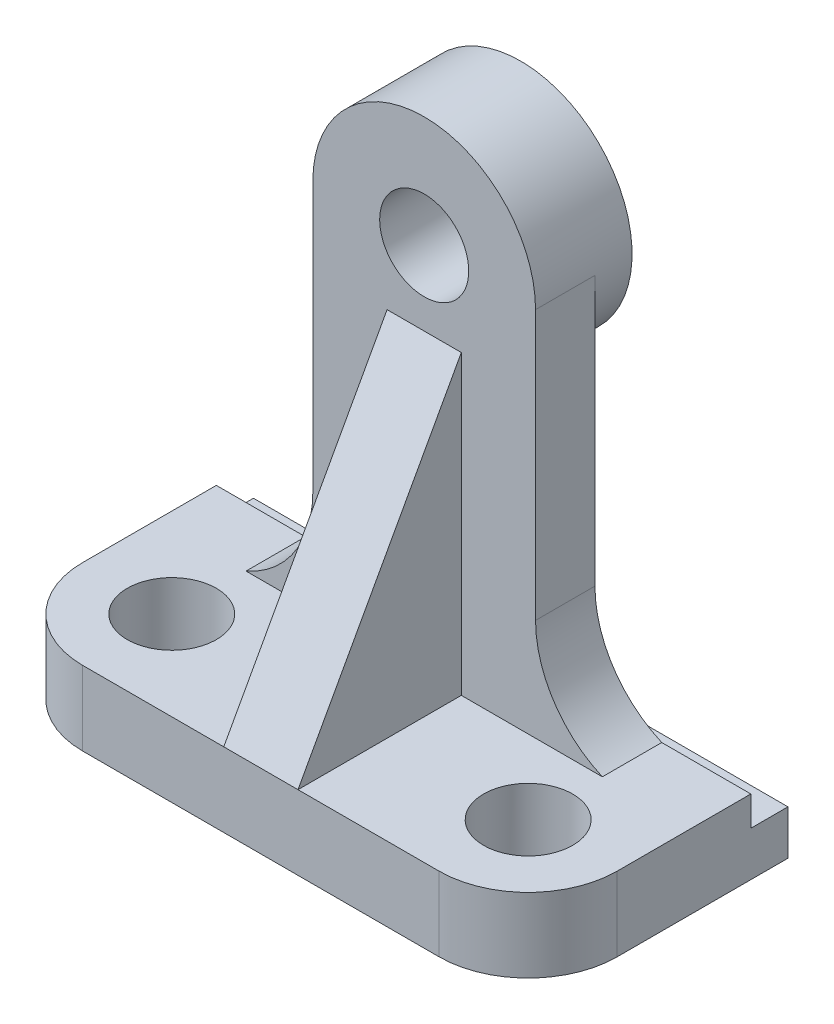
ISO-10303-21;
HEADER;
FILE_DESCRIPTION(('STEP AP214'),'2;1');
FILE_NAME('part.step','',(''),(''),'','','');
FILE_SCHEMA(('AUTOMOTIVE_DESIGN { 1 0 10303 214 1 1 1 1 }'));
ENDSEC;
DATA;
#1=APPLICATION_CONTEXT('core data for automotive mechanical design processes');
#2=APPLICATION_PROTOCOL_DEFINITION('international standard','automotive_design',2000,#1);
#3=PRODUCT_CONTEXT('',#1,'mechanical');
#4=PRODUCT('Part','Part','',(#3));
#5=PRODUCT_RELATED_PRODUCT_CATEGORY('part','',(#4));
#6=PRODUCT_DEFINITION_FORMATION('','',#4);
#7=PRODUCT_DEFINITION_CONTEXT('part definition',#1,'design');
#8=PRODUCT_DEFINITION('design','',#6,#7);
#9=PRODUCT_DEFINITION_SHAPE('','',#8);
#10=(LENGTH_UNIT() NAMED_UNIT(*) SI_UNIT(.MILLI.,.METRE.));
#11=(NAMED_UNIT(*) PLANE_ANGLE_UNIT() SI_UNIT($,.RADIAN.));
#12=(NAMED_UNIT(*) SI_UNIT($,.STERADIAN.) SOLID_ANGLE_UNIT());
#13=UNCERTAINTY_MEASURE_WITH_UNIT(LENGTH_MEASURE(1.E-05),#10,'distance_accuracy_value','');
#14=(GEOMETRIC_REPRESENTATION_CONTEXT(3) GLOBAL_UNCERTAINTY_ASSIGNED_CONTEXT((#13)) GLOBAL_UNIT_ASSIGNED_CONTEXT((#10,
#11,#12)) REPRESENTATION_CONTEXT('',''));
#15=CARTESIAN_POINT('',(0.,0.,0.));
#16=DIRECTION('',(0.,0.,1.));
#17=DIRECTION('',(1.,0.,0.));
#18=AXIS2_PLACEMENT_3D('',#15,#16,#17);
#19=CARTESIAN_POINT('',(24.,10.,5.50000000000001));
#20=DIRECTION('',(0.,-1.,0.));
#21=DIRECTION('',(0.,0.,-1.));
#22=AXIS2_PLACEMENT_3D('',#19,#20,#21);
#23=PLANE('',#22);
#24=CARTESIAN_POINT('',(-24.,10.,5.49999999999999));
#25=DIRECTION('',(0.,1.,0.));
#26=DIRECTION('',(0.,0.,-1.));
#27=AXIS2_PLACEMENT_3D('',#24,#25,#26);
#28=CIRCLE('',#27,5.99999999999999);
#29=CARTESIAN_POINT('',(-24.,10.,-0.500000000000001));
#30=VERTEX_POINT('',#29);
#31=EDGE_CURVE('E256',#30,#30,#28,.T.);
#32=ORIENTED_EDGE('',*,*,#31,.F.);
#33=EDGE_LOOP('',(#32));
#34=FACE_BOUND('',#33,.T.);
#35=DIRECTION('',(0.,0.,1.));
#36=VECTOR('',#35,1.);
#37=CARTESIAN_POINT('',(-5.,10.,5.50000000000001));
#38=LINE('',#37,#36);
#39=CARTESIAN_POINT('',(-5.,10.,-4.50000000000002));
#40=VERTEX_POINT('',#39);
#41=CARTESIAN_POINT('',(-5.,10.,17.5));
#42=VERTEX_POINT('',#41);
#43=EDGE_CURVE('E173',#40,#42,#38,.T.);
#44=ORIENTED_EDGE('',*,*,#43,.F.);
#45=DIRECTION('',(-1.,0.,0.));
#46=VECTOR('',#45,1.);
#47=CARTESIAN_POINT('',(-24.,10.,-4.50000000000001));
#48=LINE('',#47,#46);
#49=CARTESIAN_POINT('',(-24.,10.,-4.50000000000001));
#50=VERTEX_POINT('',#49);
#51=EDGE_CURVE('E157',#40,#50,#48,.T.);
#52=ORIENTED_EDGE('',*,*,#51,.T.);
#53=DIRECTION('',(0.,0.,-1.));
#54=VECTOR('',#53,1.);
#55=CARTESIAN_POINT('',(-24.,10.,-4.50000000000001));
#56=LINE('',#55,#54);
#57=CARTESIAN_POINT('',(-24.,10.,-12.5));
#58=VERTEX_POINT('',#57);
#59=EDGE_CURVE('E229',#50,#58,#56,.T.);
#60=ORIENTED_EDGE('',*,*,#59,.T.);
#61=DIRECTION('',(-1.,0.,0.));
#62=VECTOR('',#61,1.);
#63=CARTESIAN_POINT('',(24.,10.,-12.5));
#64=LINE('',#63,#62);
#65=CARTESIAN_POINT('',(-36.,10.,-12.5));
#66=VERTEX_POINT('',#65);
#67=EDGE_CURVE('E44',#58,#66,#64,.T.);
#68=ORIENTED_EDGE('',*,*,#67,.T.);
#69=DIRECTION('',(0.,0.,1.));
#70=VECTOR('',#69,1.);
#71=CARTESIAN_POINT('',(-36.,10.,5.50000000000001));
#72=LINE('',#71,#70);
#73=CARTESIAN_POINT('',(-36.,10.,5.50000000000001));
#74=VERTEX_POINT('',#73);
#75=EDGE_CURVE('E301',#66,#74,#72,.T.);
#76=ORIENTED_EDGE('',*,*,#75,.T.);
#77=CARTESIAN_POINT('',(-24.,10.,5.50000000000001));
#78=DIRECTION('',(0.,1.,0.));
#79=DIRECTION('',(0.,0.,-1.));
#80=AXIS2_PLACEMENT_3D('',#77,#78,#79);
#81=CIRCLE('',#80,12.);
#82=CARTESIAN_POINT('',(-24.,10.,17.5));
#83=VERTEX_POINT('',#82);
#84=EDGE_CURVE('E303',#74,#83,#81,.T.);
#85=ORIENTED_EDGE('',*,*,#84,.T.);
#86=DIRECTION('',(1.,0.,0.));
#87=VECTOR('',#86,1.);
#88=CARTESIAN_POINT('',(24.,10.,17.5));
#89=LINE('',#88,#87);
#90=EDGE_CURVE('E174',#83,#42,#89,.T.);
#91=ORIENTED_EDGE('',*,*,#90,.T.);
#92=EDGE_LOOP('',(#44,#52,#60,#68,#76,#85,#91));
#93=FACE_BOUND('',#92,.T.);
#94=ADVANCED_FACE('F35',(#34,#93),#23,.F.);
#95=CARTESIAN_POINT('',(38.,6.,-12.5));
#96=DIRECTION('',(0.,0.,1.));
#97=DIRECTION('',(1.,0.,0.));
#98=AXIS2_PLACEMENT_3D('',#95,#96,#97);
#99=PLANE('',#98);
#100=DIRECTION('',(-1.,0.,0.));
#101=VECTOR('',#100,1.);
#102=CARTESIAN_POINT('',(38.,6.,-12.5));
#103=LINE('',#102,#101);
#104=CARTESIAN_POINT('',(36.,6.,-12.5));
#105=VERTEX_POINT('',#104);
#106=CARTESIAN_POINT('',(-36.,6.,-12.5));
#107=VERTEX_POINT('',#106);
#108=EDGE_CURVE('E292',#105,#107,#103,.T.);
#109=ORIENTED_EDGE('',*,*,#108,.T.);
#110=DIRECTION('',(0.,1.,0.));
#111=VECTOR('',#110,1.);
#112=CARTESIAN_POINT('',(-36.,6.,-12.5));
#113=LINE('',#112,#111);
#114=EDGE_CURVE('E288',#107,#66,#113,.T.);
#115=ORIENTED_EDGE('',*,*,#114,.T.);
#116=ORIENTED_EDGE('',*,*,#67,.F.);
#117=CARTESIAN_POINT('',(-30.,23.7477270848675,-12.5));
#118=DIRECTION('',(0.,0.,1.));
#119=DIRECTION('',(-1.,0.,0.));
#120=AXIS2_PLACEMENT_3D('',#117,#118,#119);
#121=CIRCLE('',#120,15.);
#122=CARTESIAN_POINT('',(-15.,23.7477270848675,-12.5));
#123=VERTEX_POINT('',#122);
#124=EDGE_CURVE('E222',#58,#123,#121,.T.);
#125=ORIENTED_EDGE('',*,*,#124,.T.);
#126=DIRECTION('',(0.,1.,0.));
#127=VECTOR('',#126,1.);
#128=CARTESIAN_POINT('',(-15.,60.,-12.5));
#129=LINE('',#128,#127);
#130=CARTESIAN_POINT('',(-15.,60.,-12.5));
#131=VERTEX_POINT('',#130);
#132=EDGE_CURVE('E207',#123,#131,#129,.T.);
#133=ORIENTED_EDGE('',*,*,#132,.T.);
#134=CARTESIAN_POINT('',(0.,60.,-12.5));
#135=DIRECTION('',(0.,0.,-1.));
#136=DIRECTION('',(-1.,0.,0.));
#137=AXIS2_PLACEMENT_3D('',#134,#135,#136);
#138=CIRCLE('',#137,15.);
#139=CARTESIAN_POINT('',(15.,60.,-12.5));
#140=VERTEX_POINT('',#139);
#141=EDGE_CURVE('E197',#140,#131,#138,.T.);
#142=ORIENTED_EDGE('',*,*,#141,.F.);
#143=DIRECTION('',(0.,-1.,0.));
#144=VECTOR('',#143,1.);
#145=CARTESIAN_POINT('',(15.,60.,-12.5));
#146=LINE('',#145,#144);
#147=CARTESIAN_POINT('',(15.,23.7477270848675,-12.5));
#148=VERTEX_POINT('',#147);
#149=EDGE_CURVE('E201',#140,#148,#146,.T.);
#150=ORIENTED_EDGE('',*,*,#149,.T.);
#151=CARTESIAN_POINT('',(30.,23.7477270848675,-12.5));
#152=DIRECTION('',(0.,0.,1.));
#153=DIRECTION('',(1.,0.,0.));
#154=AXIS2_PLACEMENT_3D('',#151,#152,#153);
#155=CIRCLE('',#154,15.);
#156=CARTESIAN_POINT('',(24.,10.,-12.5));
#157=VERTEX_POINT('',#156);
#158=EDGE_CURVE('E219',#148,#157,#155,.T.);
#159=ORIENTED_EDGE('',*,*,#158,.T.);
#160=CARTESIAN_POINT('',(36.,10.,-12.5));
#161=VERTEX_POINT('',#160);
#162=EDGE_CURVE('E11',#161,#157,#64,.T.);
#163=ORIENTED_EDGE('',*,*,#162,.F.);
#164=DIRECTION('',(0.,1.,0.));
#165=VECTOR('',#164,1.);
#166=CARTESIAN_POINT('',(36.,10.,-12.5));
#167=LINE('',#166,#165);
#168=EDGE_CURVE('E294',#105,#161,#167,.T.);
#169=ORIENTED_EDGE('',*,*,#168,.F.);
#170=EDGE_LOOP('',(#109,#115,#116,#125,#133,#142,#150,#159,#163,#169));
#171=FACE_BOUND('',#170,.T.);
#172=ADVANCED_FACE('F274',(#171),#99,.F.);
#173=CARTESIAN_POINT('',(24.,10.,5.49999999999999));
#174=DIRECTION('',(0.,1.,0.));
#175=DIRECTION('',(0.,0.,1.));
#176=AXIS2_PLACEMENT_3D('',#173,#174,#175);
#177=CIRCLE('',#176,6.);
#178=CARTESIAN_POINT('',(24.,10.,11.5));
#179=VERTEX_POINT('',#178);
#180=EDGE_CURVE('E248',#179,#179,#177,.T.);
#181=ORIENTED_EDGE('',*,*,#180,.F.);
#182=EDGE_LOOP('',(#181));
#183=FACE_BOUND('',#182,.T.);
#184=CARTESIAN_POINT('',(24.,10.,-4.50000000000002));
#185=VERTEX_POINT('',#184);
#186=CARTESIAN_POINT('',(5.,10.,-4.50000000000002));
#187=VERTEX_POINT('',#186);
#188=EDGE_CURVE('E169',#185,#187,#48,.T.);
#189=ORIENTED_EDGE('',*,*,#188,.T.);
#190=DIRECTION('',(0.,0.,1.));
#191=VECTOR('',#190,1.);
#192=CARTESIAN_POINT('',(5.,10.,5.50000000000001));
#193=LINE('',#192,#191);
#194=CARTESIAN_POINT('',(5.,10.,17.5));
#195=VERTEX_POINT('',#194);
#196=EDGE_CURVE('E52',#187,#195,#193,.T.);
#197=ORIENTED_EDGE('',*,*,#196,.T.);
#198=CARTESIAN_POINT('',(24.,10.,17.5));
#199=VERTEX_POINT('',#198);
#200=EDGE_CURVE('E306',#195,#199,#89,.T.);
#201=ORIENTED_EDGE('',*,*,#200,.T.);
#202=CARTESIAN_POINT('',(24.,10.,5.50000000000001));
#203=DIRECTION('',(0.,1.,0.));
#204=DIRECTION('',(0.,0.,-1.));
#205=AXIS2_PLACEMENT_3D('',#202,#203,#204);
#206=CIRCLE('',#205,12.);
#207=CARTESIAN_POINT('',(36.,10.,5.5));
#208=VERTEX_POINT('',#207);
#209=EDGE_CURVE('E308',#199,#208,#206,.T.);
#210=ORIENTED_EDGE('',*,*,#209,.T.);
#211=DIRECTION('',(0.,0.,-1.));
#212=VECTOR('',#211,1.);
#213=CARTESIAN_POINT('',(36.,10.,-17.5));
#214=LINE('',#213,#212);
#215=EDGE_CURVE('E310',#208,#161,#214,.T.);
#216=ORIENTED_EDGE('',*,*,#215,.T.);
#217=ORIENTED_EDGE('',*,*,#162,.T.);
#218=DIRECTION('',(0.,0.,-1.));
#219=VECTOR('',#218,1.);
#220=CARTESIAN_POINT('',(24.,10.,-4.50000000000002));
#221=LINE('',#220,#219);
#222=EDGE_CURVE('E237',#185,#157,#221,.T.);
#223=ORIENTED_EDGE('',*,*,#222,.F.);
#224=EDGE_LOOP('',(#189,#197,#201,#210,#216,#217,#223));
#225=FACE_BOUND('',#224,.T.);
#226=ADVANCED_FACE('F268',(#183,#225),#23,.F.);
#227=CARTESIAN_POINT('',(-36.,10.,5.50000000000001));
#228=DIRECTION('',(1.,0.,0.));
#229=DIRECTION('',(0.,0.,-1.));
#230=AXIS2_PLACEMENT_3D('',#227,#228,#229);
#231=PLANE('',#230);
#232=ORIENTED_EDGE('',*,*,#75,.F.);
#233=ORIENTED_EDGE('',*,*,#114,.F.);
#234=DIRECTION('',(0.,0.,1.));
#235=VECTOR('',#234,1.);
#236=CARTESIAN_POINT('',(-36.,6.,-17.5));
#237=LINE('',#236,#235);
#238=CARTESIAN_POINT('',(-36.,6.,-17.5));
#239=VERTEX_POINT('',#238);
#240=EDGE_CURVE('E226',#239,#107,#237,.T.);
#241=ORIENTED_EDGE('',*,*,#240,.F.);
#242=DIRECTION('',(0.,-1.,0.));
#243=VECTOR('',#242,1.);
#244=CARTESIAN_POINT('',(-36.,10.,-17.5));
#245=LINE('',#244,#243);
#246=CARTESIAN_POINT('',(-36.,0.,-17.5));
#247=VERTEX_POINT('',#246);
#248=EDGE_CURVE('E312',#239,#247,#245,.T.);
#249=ORIENTED_EDGE('',*,*,#248,.T.);
#250=DIRECTION('',(0.,0.,1.));
#251=VECTOR('',#250,1.);
#252=CARTESIAN_POINT('',(-36.,0.,5.50000000000001));
#253=LINE('',#252,#251);
#254=CARTESIAN_POINT('',(-36.,0.,5.50000000000001));
#255=VERTEX_POINT('',#254);
#256=EDGE_CURVE('E300',#247,#255,#253,.T.);
#257=ORIENTED_EDGE('',*,*,#256,.T.);
#258=DIRECTION('',(0.,-1.,0.));
#259=VECTOR('',#258,1.);
#260=CARTESIAN_POINT('',(-36.,10.,5.50000000000001));
#261=LINE('',#260,#259);
#262=EDGE_CURVE('E338',#74,#255,#261,.T.);
#263=ORIENTED_EDGE('',*,*,#262,.F.);
#264=EDGE_LOOP('',(#232,#233,#241,#249,#257,#263));
#265=FACE_BOUND('',#264,.T.);
#266=ADVANCED_FACE('F37',(#265),#231,.F.);
#267=CARTESIAN_POINT('',(-24.,10.,5.50000000000001));
#268=DIRECTION('',(0.,-1.,0.));
#269=DIRECTION('',(0.,0.,-1.));
#270=AXIS2_PLACEMENT_3D('',#267,#268,#269);
#271=CYLINDRICAL_SURFACE('',#270,12.);
#272=CARTESIAN_POINT('',(-24.,0.,5.50000000000001));
#273=DIRECTION('',(0.,1.,0.));
#274=DIRECTION('',(0.,0.,-1.));
#275=AXIS2_PLACEMENT_3D('',#272,#273,#274);
#276=CIRCLE('',#275,12.);
#277=CARTESIAN_POINT('',(-24.,0.,17.5));
#278=VERTEX_POINT('',#277);
#279=EDGE_CURVE('E315',#255,#278,#276,.T.);
#280=ORIENTED_EDGE('',*,*,#279,.T.);
#281=DIRECTION('',(0.,-1.,0.));
#282=VECTOR('',#281,1.);
#283=CARTESIAN_POINT('',(-24.,10.,17.5));
#284=LINE('',#283,#282);
#285=EDGE_CURVE('E335',#83,#278,#284,.T.);
#286=ORIENTED_EDGE('',*,*,#285,.F.);
#287=ORIENTED_EDGE('',*,*,#84,.F.);
#288=ORIENTED_EDGE('',*,*,#262,.T.);
#289=EDGE_LOOP('',(#280,#286,#287,#288));
#290=FACE_BOUND('',#289,.T.);
#291=ADVANCED_FACE('F360',(#290),#271,.T.);
#292=CARTESIAN_POINT('',(24.,10.,17.5));
#293=DIRECTION('',(0.,0.,-1.));
#294=DIRECTION('',(-1.,0.,0.));
#295=AXIS2_PLACEMENT_3D('',#292,#293,#294);
#296=PLANE('',#295);
#297=ORIENTED_EDGE('',*,*,#200,.F.);
#298=DIRECTION('',(-1.,0.,0.));
#299=VECTOR('',#298,1.);
#300=CARTESIAN_POINT('',(24.,10.,17.5));
#301=LINE('',#300,#299);
#302=EDGE_CURVE('E59',#42,#195,#301,.F.);
#303=ORIENTED_EDGE('',*,*,#302,.F.);
#304=ORIENTED_EDGE('',*,*,#90,.F.);
#305=ORIENTED_EDGE('',*,*,#285,.T.);
#306=DIRECTION('',(1.,0.,0.));
#307=VECTOR('',#306,1.);
#308=CARTESIAN_POINT('',(24.,0.,17.5));
#309=LINE('',#308,#307);
#310=CARTESIAN_POINT('',(24.,0.,17.5));
#311=VERTEX_POINT('',#310);
#312=EDGE_CURVE('E317',#278,#311,#309,.T.);
#313=ORIENTED_EDGE('',*,*,#312,.T.);
#314=DIRECTION('',(0.,-1.,0.));
#315=VECTOR('',#314,1.);
#316=CARTESIAN_POINT('',(24.,10.,17.5));
#317=LINE('',#316,#315);
#318=EDGE_CURVE('E332',#199,#311,#317,.T.);
#319=ORIENTED_EDGE('',*,*,#318,.F.);
#320=EDGE_LOOP('',(#297,#303,#304,#305,#313,#319));
#321=FACE_BOUND('',#320,.T.);
#322=ADVANCED_FACE('F363',(#321),#296,.F.);
#323=CARTESIAN_POINT('',(24.,10.,5.50000000000001));
#324=DIRECTION('',(0.,-1.,0.));
#325=DIRECTION('',(0.,0.,-1.));
#326=AXIS2_PLACEMENT_3D('',#323,#324,#325);
#327=CYLINDRICAL_SURFACE('',#326,12.);
#328=CARTESIAN_POINT('',(24.,0.,5.50000000000001));
#329=DIRECTION('',(0.,1.,0.));
#330=DIRECTION('',(0.,0.,-1.));
#331=AXIS2_PLACEMENT_3D('',#328,#329,#330);
#332=CIRCLE('',#331,12.);
#333=CARTESIAN_POINT('',(36.,0.,5.5));
#334=VERTEX_POINT('',#333);
#335=EDGE_CURVE('E319',#311,#334,#332,.T.);
#336=ORIENTED_EDGE('',*,*,#335,.T.);
#337=DIRECTION('',(0.,-1.,0.));
#338=VECTOR('',#337,1.);
#339=CARTESIAN_POINT('',(36.,10.,5.5));
#340=LINE('',#339,#338);
#341=EDGE_CURVE('E329',#208,#334,#340,.T.);
#342=ORIENTED_EDGE('',*,*,#341,.F.);
#343=ORIENTED_EDGE('',*,*,#209,.F.);
#344=ORIENTED_EDGE('',*,*,#318,.T.);
#345=EDGE_LOOP('',(#336,#342,#343,#344));
#346=FACE_BOUND('',#345,.T.);
#347=ADVANCED_FACE('F366',(#346),#327,.T.);
#348=CARTESIAN_POINT('',(36.,10.,-17.5));
#349=DIRECTION('',(-1.,0.,0.));
#350=DIRECTION('',(0.,0.,1.));
#351=AXIS2_PLACEMENT_3D('',#348,#349,#350);
#352=PLANE('',#351);
#353=DIRECTION('',(0.,0.,1.));
#354=VECTOR('',#353,1.);
#355=CARTESIAN_POINT('',(36.,6.,-17.5));
#356=LINE('',#355,#354);
#357=CARTESIAN_POINT('',(36.,6.,-17.5));
#358=VERTEX_POINT('',#357);
#359=EDGE_CURVE('E297',#358,#105,#356,.T.);
#360=ORIENTED_EDGE('',*,*,#359,.T.);
#361=ORIENTED_EDGE('',*,*,#168,.T.);
#362=ORIENTED_EDGE('',*,*,#215,.F.);
#363=ORIENTED_EDGE('',*,*,#341,.T.);
#364=DIRECTION('',(0.,0.,-1.));
#365=VECTOR('',#364,1.);
#366=CARTESIAN_POINT('',(36.,0.,-17.5));
#367=LINE('',#366,#365);
#368=CARTESIAN_POINT('',(36.,0.,-17.5));
#369=VERTEX_POINT('',#368);
#370=EDGE_CURVE('E321',#334,#369,#367,.T.);
#371=ORIENTED_EDGE('',*,*,#370,.T.);
#372=DIRECTION('',(0.,-1.,0.));
#373=VECTOR('',#372,1.);
#374=CARTESIAN_POINT('',(36.,10.,-17.5));
#375=LINE('',#374,#373);
#376=EDGE_CURVE('E327',#358,#369,#375,.T.);
#377=ORIENTED_EDGE('',*,*,#376,.F.);
#378=EDGE_LOOP('',(#360,#361,#362,#363,#371,#377));
#379=FACE_BOUND('',#378,.T.);
#380=ADVANCED_FACE('F372',(#379),#352,.F.);
#381=CARTESIAN_POINT('',(-36.,10.,-17.5));
#382=DIRECTION('',(0.,0.,1.));
#383=DIRECTION('',(1.,0.,0.));
#384=AXIS2_PLACEMENT_3D('',#381,#382,#383);
#385=PLANE('',#384);
#386=DIRECTION('',(-1.,0.,0.));
#387=VECTOR('',#386,1.);
#388=CARTESIAN_POINT('',(-36.,0.,-17.5));
#389=LINE('',#388,#387);
#390=EDGE_CURVE('E304',#369,#247,#389,.T.);
#391=ORIENTED_EDGE('',*,*,#390,.T.);
#392=ORIENTED_EDGE('',*,*,#248,.F.);
#393=DIRECTION('',(-1.,0.,0.));
#394=VECTOR('',#393,1.);
#395=CARTESIAN_POINT('',(38.,6.,-17.5));
#396=LINE('',#395,#394);
#397=EDGE_CURVE('E291',#358,#239,#396,.T.);
#398=ORIENTED_EDGE('',*,*,#397,.F.);
#399=ORIENTED_EDGE('',*,*,#376,.T.);
#400=EDGE_LOOP('',(#391,#392,#398,#399));
#401=FACE_BOUND('',#400,.T.);
#402=ADVANCED_FACE('F412',(#401),#385,.F.);
#403=CARTESIAN_POINT('',(24.,0.,5.50000000000001));
#404=DIRECTION('',(0.,-1.,0.));
#405=DIRECTION('',(0.,0.,-1.));
#406=AXIS2_PLACEMENT_3D('',#403,#404,#405);
#407=PLANE('',#406);
#408=CARTESIAN_POINT('',(-24.,0.,5.49999999999999));
#409=DIRECTION('',(0.,-1.,0.));
#410=DIRECTION('',(0.,0.,-1.));
#411=AXIS2_PLACEMENT_3D('',#408,#409,#410);
#412=CIRCLE('',#411,5.99999999999999);
#413=CARTESIAN_POINT('',(-24.,0.,-0.500000000000001));
#414=VERTEX_POINT('',#413);
#415=EDGE_CURVE('E39',#414,#414,#412,.T.);
#416=ORIENTED_EDGE('',*,*,#415,.F.);
#417=EDGE_LOOP('',(#416));
#418=FACE_BOUND('',#417,.T.);
#419=CARTESIAN_POINT('',(24.,0.,5.49999999999999));
#420=DIRECTION('',(0.,-1.,0.));
#421=DIRECTION('',(0.,0.,-1.));
#422=AXIS2_PLACEMENT_3D('',#419,#420,#421);
#423=CIRCLE('',#422,6.);
#424=CARTESIAN_POINT('',(24.,0.,-0.500000000000011));
#425=VERTEX_POINT('',#424);
#426=EDGE_CURVE('E246',#425,#425,#423,.T.);
#427=ORIENTED_EDGE('',*,*,#426,.F.);
#428=EDGE_LOOP('',(#427));
#429=FACE_BOUND('',#428,.T.);
#430=ORIENTED_EDGE('',*,*,#335,.F.);
#431=ORIENTED_EDGE('',*,*,#312,.F.);
#432=ORIENTED_EDGE('',*,*,#279,.F.);
#433=ORIENTED_EDGE('',*,*,#256,.F.);
#434=ORIENTED_EDGE('',*,*,#390,.F.);
#435=ORIENTED_EDGE('',*,*,#370,.F.);
#436=EDGE_LOOP('',(#430,#431,#432,#433,#434,#435));
#437=FACE_BOUND('',#436,.T.);
#438=ADVANCED_FACE('F420',(#418,#429,#437),#407,.T.);
#439=CARTESIAN_POINT('',(38.,6.,-17.5));
#440=DIRECTION('',(0.,-1.,0.));
#441=DIRECTION('',(0.,0.,-1.));
#442=AXIS2_PLACEMENT_3D('',#439,#440,#441);
#443=PLANE('',#442);
#444=ORIENTED_EDGE('',*,*,#397,.T.);
#445=ORIENTED_EDGE('',*,*,#240,.T.);
#446=ORIENTED_EDGE('',*,*,#108,.F.);
#447=ORIENTED_EDGE('',*,*,#359,.F.);
#448=EDGE_LOOP('',(#444,#445,#446,#447));
#449=FACE_BOUND('',#448,.T.);
#450=ADVANCED_FACE('F429',(#449),#443,.F.);
#451=CARTESIAN_POINT('',(0.,60.,-4.50000000000002));
#452=DIRECTION('',(0.,0.,-1.));
#453=DIRECTION('',(-1.,0.,0.));
#454=AXIS2_PLACEMENT_3D('',#451,#452,#453);
#455=CYLINDRICAL_SURFACE('',#454,15.);
#456=ORIENTED_EDGE('',*,*,#141,.T.);
#457=DIRECTION('',(0.,0.,-1.));
#458=VECTOR('',#457,1.);
#459=CARTESIAN_POINT('',(-15.,60.,-4.50000000000001));
#460=LINE('',#459,#458);
#461=CARTESIAN_POINT('',(-15.,60.,-4.50000000000001));
#462=VERTEX_POINT('',#461);
#463=EDGE_CURVE('E223',#462,#131,#460,.T.);
#464=ORIENTED_EDGE('',*,*,#463,.F.);
#465=CARTESIAN_POINT('',(0.,60.,-4.50000000000002));
#466=DIRECTION('',(0.,0.,-1.));
#467=DIRECTION('',(-1.,0.,0.));
#468=AXIS2_PLACEMENT_3D('',#465,#466,#467);
#469=CIRCLE('',#468,15.);
#470=CARTESIAN_POINT('',(15.,60.,-4.50000000000002));
#471=VERTEX_POINT('',#470);
#472=EDGE_CURVE('E203',#462,#471,#469,.T.);
#473=ORIENTED_EDGE('',*,*,#472,.T.);
#474=DIRECTION('',(0.,0.,-1.));
#475=VECTOR('',#474,1.);
#476=CARTESIAN_POINT('',(15.,60.,-4.50000000000002));
#477=LINE('',#476,#475);
#478=EDGE_CURVE('E216',#471,#140,#477,.T.);
#479=ORIENTED_EDGE('',*,*,#478,.T.);
#480=EDGE_LOOP('',(#456,#464,#473,#479));
#481=FACE_BOUND('',#480,.T.);
#482=CARTESIAN_POINT('',(0.,60.,-17.5));
#483=DIRECTION('',(0.,0.,-1.));
#484=DIRECTION('',(-1.,0.,0.));
#485=AXIS2_PLACEMENT_3D('',#482,#483,#484);
#486=CIRCLE('',#485,15.);
#487=CARTESIAN_POINT('',(-15.,60.,-17.5));
#488=VERTEX_POINT('',#487);
#489=EDGE_CURVE('E198',#488,#488,#486,.T.);
#490=ORIENTED_EDGE('',*,*,#489,.F.);
#491=EDGE_LOOP('',(#490));
#492=FACE_BOUND('',#491,.T.);
#493=ADVANCED_FACE('F282',(#481,#492),#455,.T.);
#494=CARTESIAN_POINT('',(-15.,60.,-4.50000000000001));
#495=DIRECTION('',(-1.,0.,0.));
#496=DIRECTION('',(0.,0.,1.));
#497=AXIS2_PLACEMENT_3D('',#494,#495,#496);
#498=PLANE('',#497);
#499=ORIENTED_EDGE('',*,*,#132,.F.);
#500=DIRECTION('',(0.,0.,-1.));
#501=VECTOR('',#500,1.);
#502=CARTESIAN_POINT('',(-15.,23.7477270848675,-4.50000000000001));
#503=LINE('',#502,#501);
#504=CARTESIAN_POINT('',(-15.,23.7477270848675,-4.50000000000001));
#505=VERTEX_POINT('',#504);
#506=EDGE_CURVE('E227',#505,#123,#503,.T.);
#507=ORIENTED_EDGE('',*,*,#506,.F.);
#508=DIRECTION('',(0.,1.,0.));
#509=VECTOR('',#508,1.);
#510=CARTESIAN_POINT('',(-15.,60.,-4.50000000000001));
#511=LINE('',#510,#509);
#512=EDGE_CURVE('E213',#505,#462,#511,.T.);
#513=ORIENTED_EDGE('',*,*,#512,.T.);
#514=ORIENTED_EDGE('',*,*,#463,.T.);
#515=EDGE_LOOP('',(#499,#507,#513,#514));
#516=FACE_BOUND('',#515,.T.);
#517=ADVANCED_FACE('F349',(#516),#498,.T.);
#518=CARTESIAN_POINT('',(-30.,23.7477270848675,-4.50000000000001));
#519=DIRECTION('',(0.,0.,-1.));
#520=DIRECTION('',(-1.,0.,0.));
#521=AXIS2_PLACEMENT_3D('',#518,#519,#520);
#522=CYLINDRICAL_SURFACE('',#521,15.);
#523=ORIENTED_EDGE('',*,*,#124,.F.);
#524=ORIENTED_EDGE('',*,*,#59,.F.);
#525=CARTESIAN_POINT('',(-30.,23.7477270848675,-4.50000000000001));
#526=DIRECTION('',(0.,0.,1.));
#527=DIRECTION('',(-1.,0.,0.));
#528=AXIS2_PLACEMENT_3D('',#525,#526,#527);
#529=CIRCLE('',#528,15.);
#530=EDGE_CURVE('E165',#50,#505,#529,.T.);
#531=ORIENTED_EDGE('',*,*,#530,.T.);
#532=ORIENTED_EDGE('',*,*,#506,.T.);
#533=EDGE_LOOP('',(#523,#524,#531,#532));
#534=FACE_BOUND('',#533,.T.);
#535=ADVANCED_FACE('F350',(#534),#522,.F.);
#536=CARTESIAN_POINT('',(30.,23.7477270848675,-4.50000000000003));
#537=DIRECTION('',(0.,0.,-1.));
#538=DIRECTION('',(-1.,0.,0.));
#539=AXIS2_PLACEMENT_3D('',#536,#537,#538);
#540=CYLINDRICAL_SURFACE('',#539,15.);
#541=ORIENTED_EDGE('',*,*,#158,.F.);
#542=DIRECTION('',(0.,0.,-1.));
#543=VECTOR('',#542,1.);
#544=CARTESIAN_POINT('',(15.,23.7477270848675,-4.50000000000002));
#545=LINE('',#544,#543);
#546=CARTESIAN_POINT('',(15.,23.7477270848675,-4.50000000000002));
#547=VERTEX_POINT('',#546);
#548=EDGE_CURVE('E232',#547,#148,#545,.T.);
#549=ORIENTED_EDGE('',*,*,#548,.F.);
#550=CARTESIAN_POINT('',(30.,23.7477270848675,-4.50000000000003));
#551=DIRECTION('',(0.,0.,1.));
#552=DIRECTION('',(1.,0.,0.));
#553=AXIS2_PLACEMENT_3D('',#550,#551,#552);
#554=CIRCLE('',#553,15.);
#555=EDGE_CURVE('E170',#547,#185,#554,.T.);
#556=ORIENTED_EDGE('',*,*,#555,.T.);
#557=ORIENTED_EDGE('',*,*,#222,.T.);
#558=EDGE_LOOP('',(#541,#549,#556,#557));
#559=FACE_BOUND('',#558,.T.);
#560=ADVANCED_FACE('F272',(#559),#540,.F.);
#561=CARTESIAN_POINT('',(15.,60.,-4.50000000000002));
#562=DIRECTION('',(1.,0.,0.));
#563=DIRECTION('',(0.,0.,-1.));
#564=AXIS2_PLACEMENT_3D('',#561,#562,#563);
#565=PLANE('',#564);
#566=ORIENTED_EDGE('',*,*,#149,.F.);
#567=ORIENTED_EDGE('',*,*,#478,.F.);
#568=DIRECTION('',(0.,-1.,0.));
#569=VECTOR('',#568,1.);
#570=CARTESIAN_POINT('',(15.,60.,-4.50000000000002));
#571=LINE('',#570,#569);
#572=EDGE_CURVE('E206',#471,#547,#571,.T.);
#573=ORIENTED_EDGE('',*,*,#572,.T.);
#574=ORIENTED_EDGE('',*,*,#548,.T.);
#575=EDGE_LOOP('',(#566,#567,#573,#574));
#576=FACE_BOUND('',#575,.T.);
#577=ADVANCED_FACE('F279',(#576),#565,.T.);
#578=CARTESIAN_POINT('',(0.,60.,-4.50000000000002));
#579=DIRECTION('',(0.,0.,-1.));
#580=DIRECTION('',(-1.,0.,0.));
#581=AXIS2_PLACEMENT_3D('',#578,#579,#580);
#582=PLANE('',#581);
#583=CARTESIAN_POINT('',(0.,60.,-4.50000000000002));
#584=DIRECTION('',(0.,0.,-1.));
#585=DIRECTION('',(-1.,0.,0.));
#586=AXIS2_PLACEMENT_3D('',#583,#584,#585);
#587=CIRCLE('',#586,6.);
#588=CARTESIAN_POINT('',(-6.,60.,-4.50000000000002));
#589=VERTEX_POINT('',#588);
#590=EDGE_CURVE('E194',#589,#589,#587,.F.);
#591=ORIENTED_EDGE('',*,*,#590,.F.);
#592=EDGE_LOOP('',(#591));
#593=FACE_BOUND('',#592,.T.);
#594=DIRECTION('',(-1.,0.,0.));
#595=VECTOR('',#594,1.);
#596=CARTESIAN_POINT('',(0.,50.,-4.50000000000002));
#597=LINE('',#596,#595);
#598=CARTESIAN_POINT('',(-5.,50.,-4.50000000000002));
#599=VERTEX_POINT('',#598);
#600=CARTESIAN_POINT('',(5.,50.,-4.50000000000002));
#601=VERTEX_POINT('',#600);
#602=EDGE_CURVE('E188',#599,#601,#597,.F.);
#603=ORIENTED_EDGE('',*,*,#602,.T.);
#604=DIRECTION('',(0.,-1.,0.));
#605=VECTOR('',#604,1.);
#606=CARTESIAN_POINT('',(5.,60.,-4.50000000000002));
#607=LINE('',#606,#605);
#608=EDGE_CURVE('E183',#601,#187,#607,.T.);
#609=ORIENTED_EDGE('',*,*,#608,.T.);
#610=ORIENTED_EDGE('',*,*,#188,.F.);
#611=ORIENTED_EDGE('',*,*,#555,.F.);
#612=ORIENTED_EDGE('',*,*,#572,.F.);
#613=ORIENTED_EDGE('',*,*,#472,.F.);
#614=ORIENTED_EDGE('',*,*,#512,.F.);
#615=ORIENTED_EDGE('',*,*,#530,.F.);
#616=ORIENTED_EDGE('',*,*,#51,.F.);
#617=DIRECTION('',(0.,-1.,0.));
#618=VECTOR('',#617,1.);
#619=CARTESIAN_POINT('',(-5.,60.,-4.50000000000002));
#620=LINE('',#619,#618);
#621=EDGE_CURVE('E161',#599,#40,#620,.T.);
#622=ORIENTED_EDGE('',*,*,#621,.F.);
#623=EDGE_LOOP('',(#603,#609,#610,#611,#612,#613,#614,#615,#616,#622));
#624=FACE_BOUND('',#623,.T.);
#625=ADVANCED_FACE('F159',(#593,#624),#582,.F.);
#626=CARTESIAN_POINT('',(0.,60.,-17.5));
#627=DIRECTION('',(0.,0.,-1.));
#628=DIRECTION('',(-1.,0.,0.));
#629=AXIS2_PLACEMENT_3D('',#626,#627,#628);
#630=PLANE('',#629);
#631=CARTESIAN_POINT('',(0.,60.,-17.5));
#632=DIRECTION('',(0.,0.,-1.));
#633=DIRECTION('',(-1.,0.,0.));
#634=AXIS2_PLACEMENT_3D('',#631,#632,#633);
#635=CIRCLE('',#634,6.);
#636=CARTESIAN_POINT('',(-6.00000000000001,60.,-17.5));
#637=VERTEX_POINT('',#636);
#638=EDGE_CURVE('E191',#637,#637,#635,.T.);
#639=ORIENTED_EDGE('',*,*,#638,.F.);
#640=EDGE_LOOP('',(#639));
#641=FACE_BOUND('',#640,.T.);
#642=ORIENTED_EDGE('',*,*,#489,.T.);
#643=EDGE_LOOP('',(#642));
#644=FACE_BOUND('',#643,.T.);
#645=ADVANCED_FACE('F472',(#641,#644),#630,.T.);
#646=CARTESIAN_POINT('',(0.,60.,12.4705627484771));
#647=DIRECTION('',(0.,0.,-1.));
#648=DIRECTION('',(-1.,0.,0.));
#649=AXIS2_PLACEMENT_3D('',#646,#647,#648);
#650=CYLINDRICAL_SURFACE('',#649,6.);
#651=CARTESIAN_POINT('',(-6.00000000000001,60.,-17.5));
#652=CARTESIAN_POINT('',(-6.,60.,-17.3645833333333));
#653=CARTESIAN_POINT('',(-6.,60.,-17.2291666666667));
#654=CARTESIAN_POINT('',(-6.,60.,-16.9583333333333));
#655=CARTESIAN_POINT('',(-6.,60.,-16.8229166666667));
#656=CARTESIAN_POINT('',(-6.,60.,-16.5520833333333));
#657=CARTESIAN_POINT('',(-6.,60.,-16.4166666666667));
#658=CARTESIAN_POINT('',(-6.,60.,-16.1458333333333));
#659=CARTESIAN_POINT('',(-6.,60.,-16.0104166666667));
#660=CARTESIAN_POINT('',(-6.,60.,-15.7395833333333));
#661=CARTESIAN_POINT('',(-6.,60.,-15.6041666666667));
#662=CARTESIAN_POINT('',(-6.,60.,-15.3333333333333));
#663=CARTESIAN_POINT('',(-6.,60.,-15.1979166666667));
#664=CARTESIAN_POINT('',(-6.,60.,-14.9270833333333));
#665=CARTESIAN_POINT('',(-6.,60.,-14.7916666666667));
#666=CARTESIAN_POINT('',(-6.,60.,-14.5208333333333));
#667=CARTESIAN_POINT('',(-6.,60.,-14.3854166666667));
#668=CARTESIAN_POINT('',(-6.,60.,-14.1145833333333));
#669=CARTESIAN_POINT('',(-6.,60.,-13.9791666666667));
#670=CARTESIAN_POINT('',(-6.,60.,-13.7083333333333));
#671=CARTESIAN_POINT('',(-6.,60.,-13.5729166666667));
#672=CARTESIAN_POINT('',(-6.,60.,-13.3020833333333));
#673=CARTESIAN_POINT('',(-6.,60.,-13.1666666666667));
#674=CARTESIAN_POINT('',(-6.,60.,-12.8958333333333));
#675=CARTESIAN_POINT('',(-6.,60.,-12.7604166666667));
#676=CARTESIAN_POINT('',(-6.,60.,-12.4895833333333));
#677=CARTESIAN_POINT('',(-6.,60.,-12.3541666666667));
#678=CARTESIAN_POINT('',(-6.,60.,-12.0833333333333));
#679=CARTESIAN_POINT('',(-6.,60.,-11.9479166666667));
#680=CARTESIAN_POINT('',(-6.,60.,-11.6770833333333));
#681=CARTESIAN_POINT('',(-6.,60.,-11.5416666666667));
#682=CARTESIAN_POINT('',(-6.,60.,-11.2708333333333));
#683=CARTESIAN_POINT('',(-6.,60.,-11.1354166666667));
#684=CARTESIAN_POINT('',(-6.,60.,-10.8645833333333));
#685=CARTESIAN_POINT('',(-6.,60.,-10.7291666666667));
#686=CARTESIAN_POINT('',(-6.,60.,-10.4583333333333));
#687=CARTESIAN_POINT('',(-6.,60.,-10.3229166666667));
#688=CARTESIAN_POINT('',(-6.,60.,-10.0520833333333));
#689=CARTESIAN_POINT('',(-6.,60.,-9.91666666666668));
#690=CARTESIAN_POINT('',(-6.,60.,-9.64583333333334));
#691=CARTESIAN_POINT('',(-6.,60.,-9.51041666666668));
#692=CARTESIAN_POINT('',(-6.,60.,-9.23958333333334));
#693=CARTESIAN_POINT('',(-6.,60.,-9.10416666666668));
#694=CARTESIAN_POINT('',(-6.,60.,-8.83333333333335));
#695=CARTESIAN_POINT('',(-6.,60.,-8.69791666666668));
#696=CARTESIAN_POINT('',(-6.,60.,-8.42708333333334));
#697=CARTESIAN_POINT('',(-6.,60.,-8.29166666666668));
#698=CARTESIAN_POINT('',(-6.,60.,-8.02083333333335));
#699=CARTESIAN_POINT('',(-6.,60.,-7.88541666666668));
#700=CARTESIAN_POINT('',(-6.,60.,-7.61458333333335));
#701=CARTESIAN_POINT('',(-6.,60.,-7.47916666666668));
#702=CARTESIAN_POINT('',(-6.,60.,-7.20833333333335));
#703=CARTESIAN_POINT('',(-6.,60.,-7.07291666666668));
#704=CARTESIAN_POINT('',(-6.,60.,-6.80208333333335));
#705=CARTESIAN_POINT('',(-6.,60.,-6.66666666666668));
#706=CARTESIAN_POINT('',(-6.,60.,-6.39583333333335));
#707=CARTESIAN_POINT('',(-6.,60.,-6.26041666666668));
#708=CARTESIAN_POINT('',(-6.,60.,-5.98958333333335));
#709=CARTESIAN_POINT('',(-6.,60.,-5.85416666666668));
#710=CARTESIAN_POINT('',(-6.,60.,-5.58333333333335));
#711=CARTESIAN_POINT('',(-6.,60.,-5.44791666666669));
#712=CARTESIAN_POINT('',(-6.,60.,-5.17708333333335));
#713=CARTESIAN_POINT('',(-6.,60.,-5.04166666666668));
#714=CARTESIAN_POINT('',(-6.,60.,-4.77083333333335));
#715=CARTESIAN_POINT('',(-6.,60.,-4.63541666666669));
#716=CARTESIAN_POINT('',(-6.,60.,-4.50000000000002));
#717=B_SPLINE_CURVE_WITH_KNOTS('',3,(#651,#652,#653,#654,#655,#656,#657,#658,#659,#660,#661,
#662,#663,#664,#665,#666,#667,#668,#669,#670,#671,#672,#673,#674,#675,#676,#677,#678,#679,#680,
#681,#682,#683,#684,#685,#686,#687,#688,#689,#690,#691,#692,#693,#694,#695,#696,#697,#698,#699,
#700,#701,#702,#703,#704,#705,#706,#707,#708,#709,#710,#711,#712,#713,#714,#715,#716),
.UNSPECIFIED.,.F.,.F.,(4,2,2,2,2,2,2,2,2,2,2,2,2,2,2,2,2,2,2,2,2,2,2,2,2,2,2,2,2,2,2,2,4),(0.,
0.406249999999997,0.812499999999994,1.21875,1.62499999999999,2.03125,2.43749999999999,
2.84374999999999,3.24999999999999,3.65624999999999,4.06249999999999,4.46874999999999,
4.87499999999999,5.28124999999999,5.68749999999999,6.09374999999999,6.49999999999999,
6.90624999999999,7.31249999999998,7.71874999999998,8.12499999999998,8.53124999999998,
8.93749999999998,9.34374999999998,9.74999999999998,10.15625,10.5625,10.96875,11.375,11.78125,
12.1875,12.59375,13.),.UNSPECIFIED.);
#718=EDGE_CURVE('BSEAM480',#637,#589,#717,.T.);
#719=ORIENTED_EDGE('',*,*,#638,.T.);
#720=ORIENTED_EDGE('',*,*,#590,.T.);
#721=ORIENTED_EDGE('',*,*,#718,.T.);
#722=ORIENTED_EDGE('',*,*,#718,.F.);
#723=EDGE_LOOP('',(#719,#721,#720,#722));
#724=FACE_BOUND('',#723,.T.);
#725=ADVANCED_FACE('F480',(#724),#650,.F.);
#726=CARTESIAN_POINT('',(0.,10.,17.5));
#727=DIRECTION('',(0.,-0.481918749772156,-0.876215908676647));
#728=DIRECTION('',(0.,0.876215908676647,-0.481918749772156));
#729=AXIS2_PLACEMENT_3D('',#726,#727,#728);
#730=PLANE('',#729);
#731=DIRECTION('',(0.,0.876215908676647,-0.481918749772156));
#732=VECTOR('',#731,1.);
#733=CARTESIAN_POINT('',(-5.,10.,17.5));
#734=LINE('',#733,#732);
#735=EDGE_CURVE('E181',#42,#599,#734,.T.);
#736=ORIENTED_EDGE('',*,*,#735,.F.);
#737=ORIENTED_EDGE('',*,*,#302,.T.);
#738=DIRECTION('',(0.,0.876215908676647,-0.481918749772156));
#739=VECTOR('',#738,1.);
#740=CARTESIAN_POINT('',(5.,10.,17.5));
#741=LINE('',#740,#739);
#742=EDGE_CURVE('E178',#195,#601,#741,.T.);
#743=ORIENTED_EDGE('',*,*,#742,.T.);
#744=ORIENTED_EDGE('',*,*,#602,.F.);
#745=EDGE_LOOP('',(#736,#737,#743,#744));
#746=FACE_BOUND('',#745,.T.);
#747=ADVANCED_FACE('F262',(#746),#730,.F.);
#748=CARTESIAN_POINT('',(5.,37.5,0.));
#749=DIRECTION('',(1.,0.,0.));
#750=DIRECTION('',(0.,0.,-1.));
#751=AXIS2_PLACEMENT_3D('',#748,#749,#750);
#752=PLANE('',#751);
#753=ORIENTED_EDGE('',*,*,#608,.F.);
#754=ORIENTED_EDGE('',*,*,#742,.F.);
#755=ORIENTED_EDGE('',*,*,#196,.F.);
#756=EDGE_LOOP('',(#753,#754,#755));
#757=FACE_BOUND('',#756,.T.);
#758=ADVANCED_FACE('F265',(#757),#752,.T.);
#759=CARTESIAN_POINT('',(-5.,37.5,0.));
#760=DIRECTION('',(1.,0.,0.));
#761=DIRECTION('',(0.,0.,-1.));
#762=AXIS2_PLACEMENT_3D('',#759,#760,#761);
#763=PLANE('',#762);
#764=ORIENTED_EDGE('',*,*,#735,.T.);
#765=ORIENTED_EDGE('',*,*,#621,.T.);
#766=ORIENTED_EDGE('',*,*,#43,.T.);
#767=EDGE_LOOP('',(#764,#765,#766));
#768=FACE_BOUND('',#767,.T.);
#769=ADVANCED_FACE('F180',(#768),#763,.F.);
#770=CARTESIAN_POINT('',(24.,-0.999999999999999,5.49999999999999));
#771=DIRECTION('',(0.,1.,0.));
#772=DIRECTION('',(0.,0.,1.));
#773=AXIS2_PLACEMENT_3D('',#770,#771,#772);
#774=CYLINDRICAL_SURFACE('',#773,6.);
#775=ORIENTED_EDGE('',*,*,#426,.T.);
#776=EDGE_LOOP('',(#775));
#777=FACE_BOUND('',#776,.T.);
#778=ORIENTED_EDGE('',*,*,#180,.T.);
#779=EDGE_LOOP('',(#778));
#780=FACE_BOUND('',#779,.T.);
#781=ADVANCED_FACE('F507',(#777,#780),#774,.F.);
#782=CARTESIAN_POINT('',(-24.,-0.999999999999999,5.49999999999999));
#783=DIRECTION('',(0.,1.,0.));
#784=DIRECTION('',(0.,0.,1.));
#785=AXIS2_PLACEMENT_3D('',#782,#783,#784);
#786=CYLINDRICAL_SURFACE('',#785,5.99999999999999);
#787=ORIENTED_EDGE('',*,*,#415,.T.);
#788=EDGE_LOOP('',(#787));
#789=FACE_BOUND('',#788,.T.);
#790=ORIENTED_EDGE('',*,*,#31,.T.);
#791=EDGE_LOOP('',(#790));
#792=FACE_BOUND('',#791,.T.);
#793=ADVANCED_FACE('F513',(#789,#792),#786,.F.);
#794=CLOSED_SHELL('',(#94,#172,#226,#266,#291,#322,#347,#380,#402,#438,#450,#493,#517,#535,#560,
#577,#625,#645,#725,#747,#758,#769,#781,#793));
#795=MANIFOLD_SOLID_BREP('B2',#794);
#796=ADVANCED_BREP_SHAPE_REPRESENTATION('',(#18,#795),#14);
#797=SHAPE_DEFINITION_REPRESENTATION(#9,#796);
ENDSEC;
END-ISO-10303-21;
